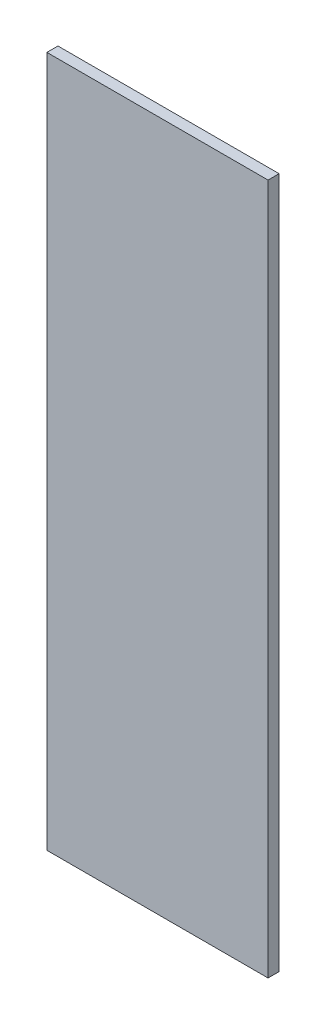
ISO-10303-21;
HEADER;
FILE_DESCRIPTION(('STEP AP214'),'2;1');
FILE_NAME('part.step','',(''),(''),'','','');
FILE_SCHEMA(('AUTOMOTIVE_DESIGN { 1 0 10303 214 1 1 1 1 }'));
ENDSEC;
DATA;
#1=APPLICATION_CONTEXT('core data for automotive mechanical design processes');
#2=APPLICATION_PROTOCOL_DEFINITION('international standard','automotive_design',2000,#1);
#3=PRODUCT_CONTEXT('',#1,'mechanical');
#4=PRODUCT('Part','Part','',(#3));
#5=PRODUCT_RELATED_PRODUCT_CATEGORY('part','',(#4));
#6=PRODUCT_DEFINITION_FORMATION('','',#4);
#7=PRODUCT_DEFINITION_CONTEXT('part definition',#1,'design');
#8=PRODUCT_DEFINITION('design','',#6,#7);
#9=PRODUCT_DEFINITION_SHAPE('','',#8);
#10=(LENGTH_UNIT() NAMED_UNIT(*) SI_UNIT(.MILLI.,.METRE.));
#11=(NAMED_UNIT(*) PLANE_ANGLE_UNIT() SI_UNIT($,.RADIAN.));
#12=(NAMED_UNIT(*) SI_UNIT($,.STERADIAN.) SOLID_ANGLE_UNIT());
#13=UNCERTAINTY_MEASURE_WITH_UNIT(LENGTH_MEASURE(1.E-05),#10,'distance_accuracy_value','');
#14=(GEOMETRIC_REPRESENTATION_CONTEXT(3) GLOBAL_UNCERTAINTY_ASSIGNED_CONTEXT((#13)) GLOBAL_UNIT_ASSIGNED_CONTEXT((#10,
#11,#12)) REPRESENTATION_CONTEXT('',''));
#15=CARTESIAN_POINT('',(0.,0.,0.));
#16=DIRECTION('',(0.,0.,1.));
#17=DIRECTION('',(1.,0.,0.));
#18=AXIS2_PLACEMENT_3D('',#15,#16,#17);
#19=CARTESIAN_POINT('',(40.,-125.,-4.));
#20=DIRECTION('',(1.,0.,0.));
#21=DIRECTION('',(0.,0.,-1.));
#22=AXIS2_PLACEMENT_3D('',#19,#20,#21);
#23=PLANE('',#22);
#24=DIRECTION('',(0.,1.,0.));
#25=VECTOR('',#24,1.);
#26=CARTESIAN_POINT('',(40.,-125.,0.));
#27=LINE('',#26,#25);
#28=CARTESIAN_POINT('',(40.,-125.,0.));
#29=VERTEX_POINT('',#28);
#30=CARTESIAN_POINT('',(40.,125.,0.));
#31=VERTEX_POINT('',#30);
#32=EDGE_CURVE('E98',#29,#31,#27,.T.);
#33=ORIENTED_EDGE('',*,*,#32,.F.);
#34=DIRECTION('',(0.,0.,1.));
#35=VECTOR('',#34,1.);
#36=CARTESIAN_POINT('',(40.,-125.,-4.));
#37=LINE('',#36,#35);
#38=CARTESIAN_POINT('',(40.,-125.,-4.));
#39=VERTEX_POINT('',#38);
#40=EDGE_CURVE('E11',#39,#29,#37,.T.);
#41=ORIENTED_EDGE('',*,*,#40,.F.);
#42=DIRECTION('',(0.,1.,0.));
#43=VECTOR('',#42,1.);
#44=CARTESIAN_POINT('',(40.,-125.,-4.));
#45=LINE('',#44,#43);
#46=CARTESIAN_POINT('',(40.,125.,-4.));
#47=VERTEX_POINT('',#46);
#48=EDGE_CURVE('E92',#39,#47,#45,.T.);
#49=ORIENTED_EDGE('',*,*,#48,.T.);
#50=DIRECTION('',(0.,0.,1.));
#51=VECTOR('',#50,1.);
#52=CARTESIAN_POINT('',(40.,125.,-4.));
#53=LINE('',#52,#51);
#54=EDGE_CURVE('E37',#47,#31,#53,.T.);
#55=ORIENTED_EDGE('',*,*,#54,.T.);
#56=EDGE_LOOP('',(#33,#41,#49,#55));
#57=FACE_BOUND('',#56,.T.);
#58=ADVANCED_FACE('F34',(#57),#23,.T.);
#59=CARTESIAN_POINT('',(-40.,-125.,-4.));
#60=DIRECTION('',(0.,-1.,0.));
#61=DIRECTION('',(0.,0.,-1.));
#62=AXIS2_PLACEMENT_3D('',#59,#60,#61);
#63=PLANE('',#62);
#64=DIRECTION('',(1.,0.,0.));
#65=VECTOR('',#64,1.);
#66=CARTESIAN_POINT('',(-40.,-125.,0.));
#67=LINE('',#66,#65);
#68=CARTESIAN_POINT('',(-40.,-125.,0.));
#69=VERTEX_POINT('',#68);
#70=EDGE_CURVE('E94',#69,#29,#67,.T.);
#71=ORIENTED_EDGE('',*,*,#70,.F.);
#72=DIRECTION('',(0.,0.,1.));
#73=VECTOR('',#72,1.);
#74=CARTESIAN_POINT('',(-40.,-125.,-4.));
#75=LINE('',#74,#73);
#76=CARTESIAN_POINT('',(-40.,-125.,-4.));
#77=VERTEX_POINT('',#76);
#78=EDGE_CURVE('E43',#77,#69,#75,.T.);
#79=ORIENTED_EDGE('',*,*,#78,.F.);
#80=DIRECTION('',(1.,0.,0.));
#81=VECTOR('',#80,1.);
#82=CARTESIAN_POINT('',(-40.,-125.,-4.));
#83=LINE('',#82,#81);
#84=EDGE_CURVE('E89',#77,#39,#83,.T.);
#85=ORIENTED_EDGE('',*,*,#84,.T.);
#86=ORIENTED_EDGE('',*,*,#40,.T.);
#87=EDGE_LOOP('',(#71,#79,#85,#86));
#88=FACE_BOUND('',#87,.T.);
#89=ADVANCED_FACE('F108',(#88),#63,.T.);
#90=CARTESIAN_POINT('',(-40.,-125.,-4.));
#91=DIRECTION('',(-1.,0.,0.));
#92=DIRECTION('',(0.,0.,1.));
#93=AXIS2_PLACEMENT_3D('',#90,#91,#92);
#94=PLANE('',#93);
#95=DIRECTION('',(0.,-1.,0.));
#96=VECTOR('',#95,1.);
#97=CARTESIAN_POINT('',(-40.,-125.,0.));
#98=LINE('',#97,#96);
#99=CARTESIAN_POINT('',(-40.,125.,0.));
#100=VERTEX_POINT('',#99);
#101=EDGE_CURVE('E84',#100,#69,#98,.T.);
#102=ORIENTED_EDGE('',*,*,#101,.F.);
#103=DIRECTION('',(0.,0.,1.));
#104=VECTOR('',#103,1.);
#105=CARTESIAN_POINT('',(-40.,125.,-4.));
#106=LINE('',#105,#104);
#107=CARTESIAN_POINT('',(-40.,125.,-4.));
#108=VERTEX_POINT('',#107);
#109=EDGE_CURVE('E79',#108,#100,#106,.T.);
#110=ORIENTED_EDGE('',*,*,#109,.F.);
#111=DIRECTION('',(0.,-1.,0.));
#112=VECTOR('',#111,1.);
#113=CARTESIAN_POINT('',(-40.,-125.,-4.));
#114=LINE('',#113,#112);
#115=EDGE_CURVE('E82',#108,#77,#114,.T.);
#116=ORIENTED_EDGE('',*,*,#115,.T.);
#117=ORIENTED_EDGE('',*,*,#78,.T.);
#118=EDGE_LOOP('',(#102,#110,#116,#117));
#119=FACE_BOUND('',#118,.T.);
#120=ADVANCED_FACE('F81',(#119),#94,.T.);
#121=CARTESIAN_POINT('',(-40.,125.,-4.));
#122=DIRECTION('',(0.,1.,0.));
#123=DIRECTION('',(0.,0.,1.));
#124=AXIS2_PLACEMENT_3D('',#121,#122,#123);
#125=PLANE('',#124);
#126=DIRECTION('',(-1.,0.,0.));
#127=VECTOR('',#126,1.);
#128=CARTESIAN_POINT('',(-40.,125.,0.));
#129=LINE('',#128,#127);
#130=EDGE_CURVE('E101',#31,#100,#129,.T.);
#131=ORIENTED_EDGE('',*,*,#130,.F.);
#132=ORIENTED_EDGE('',*,*,#54,.F.);
#133=DIRECTION('',(-1.,0.,0.));
#134=VECTOR('',#133,1.);
#135=CARTESIAN_POINT('',(-40.,125.,-4.));
#136=LINE('',#135,#134);
#137=EDGE_CURVE('E88',#47,#108,#136,.T.);
#138=ORIENTED_EDGE('',*,*,#137,.T.);
#139=ORIENTED_EDGE('',*,*,#109,.T.);
#140=EDGE_LOOP('',(#131,#132,#138,#139));
#141=FACE_BOUND('',#140,.T.);
#142=ADVANCED_FACE('F91',(#141),#125,.T.);
#143=CARTESIAN_POINT('',(0.,0.,-4.));
#144=DIRECTION('',(0.,0.,-1.));
#145=DIRECTION('',(-1.,0.,0.));
#146=AXIS2_PLACEMENT_3D('',#143,#144,#145);
#147=PLANE('',#146);
#148=ORIENTED_EDGE('',*,*,#48,.F.);
#149=ORIENTED_EDGE('',*,*,#84,.F.);
#150=ORIENTED_EDGE('',*,*,#115,.F.);
#151=ORIENTED_EDGE('',*,*,#137,.F.);
#152=EDGE_LOOP('',(#148,#149,#150,#151));
#153=FACE_BOUND('',#152,.T.);
#154=ADVANCED_FACE('F87',(#153),#147,.T.);
#155=CARTESIAN_POINT('',(0.,0.,0.));
#156=DIRECTION('',(0.,0.,-1.));
#157=DIRECTION('',(-1.,0.,0.));
#158=AXIS2_PLACEMENT_3D('',#155,#156,#157);
#159=PLANE('',#158);
#160=ORIENTED_EDGE('',*,*,#32,.T.);
#161=ORIENTED_EDGE('',*,*,#130,.T.);
#162=ORIENTED_EDGE('',*,*,#101,.T.);
#163=ORIENTED_EDGE('',*,*,#70,.T.);
#164=EDGE_LOOP('',(#160,#161,#162,#163));
#165=FACE_BOUND('',#164,.T.);
#166=ADVANCED_FACE('F107',(#165),#159,.F.);
#167=CLOSED_SHELL('',(#58,#89,#120,#142,#154,#166));
#168=MANIFOLD_SOLID_BREP('B2',#167);
#169=ADVANCED_BREP_SHAPE_REPRESENTATION('',(#18,#168),#14);
#170=SHAPE_DEFINITION_REPRESENTATION(#9,#169);
ENDSEC;
END-ISO-10303-21;
